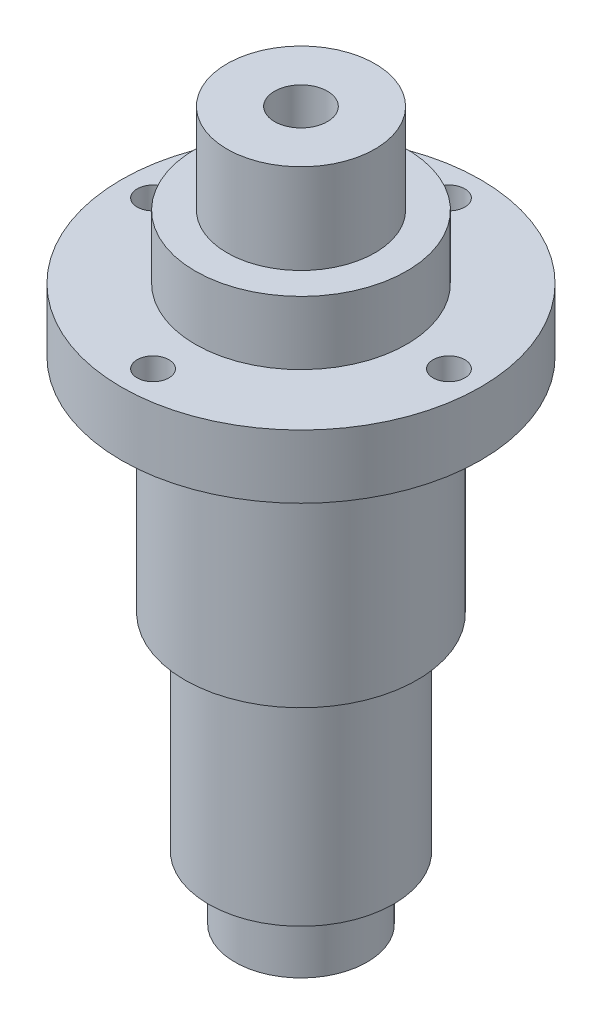
ISO-10303-21;
HEADER;
FILE_DESCRIPTION(('STEP AP214'),'2;1');
FILE_NAME('part.step','',(''),(''),'','','');
FILE_SCHEMA(('AUTOMOTIVE_DESIGN { 1 0 10303 214 1 1 1 1 }'));
ENDSEC;
DATA;
#1=APPLICATION_CONTEXT('core data for automotive mechanical design processes');
#2=APPLICATION_PROTOCOL_DEFINITION('international standard','automotive_design',2000,#1);
#3=PRODUCT_CONTEXT('',#1,'mechanical');
#4=PRODUCT('Part','Part','',(#3));
#5=PRODUCT_RELATED_PRODUCT_CATEGORY('part','',(#4));
#6=PRODUCT_DEFINITION_FORMATION('','',#4);
#7=PRODUCT_DEFINITION_CONTEXT('part definition',#1,'design');
#8=PRODUCT_DEFINITION('design','',#6,#7);
#9=PRODUCT_DEFINITION_SHAPE('','',#8);
#10=(LENGTH_UNIT() NAMED_UNIT(*) SI_UNIT(.MILLI.,.METRE.));
#11=(NAMED_UNIT(*) PLANE_ANGLE_UNIT() SI_UNIT($,.RADIAN.));
#12=(NAMED_UNIT(*) SI_UNIT($,.STERADIAN.) SOLID_ANGLE_UNIT());
#13=UNCERTAINTY_MEASURE_WITH_UNIT(LENGTH_MEASURE(1.E-05),#10,'distance_accuracy_value','');
#14=(GEOMETRIC_REPRESENTATION_CONTEXT(3) GLOBAL_UNCERTAINTY_ASSIGNED_CONTEXT((#13)) GLOBAL_UNIT_ASSIGNED_CONTEXT((#10,
#11,#12)) REPRESENTATION_CONTEXT('',''));
#15=CARTESIAN_POINT('',(0.,0.,0.));
#16=DIRECTION('',(0.,0.,1.));
#17=DIRECTION('',(1.,0.,0.));
#18=AXIS2_PLACEMENT_3D('',#15,#16,#17);
#19=CARTESIAN_POINT('',(0.,12.,0.));
#20=DIRECTION('',(0.,-1.,0.));
#21=DIRECTION('',(0.,0.,-1.));
#22=AXIS2_PLACEMENT_3D('',#19,#20,#21);
#23=CYLINDRICAL_SURFACE('',#22,20.);
#24=CARTESIAN_POINT('',(0.,12.,0.));
#25=DIRECTION('',(0.,1.,0.));
#26=DIRECTION('',(0.,0.,1.));
#27=AXIS2_PLACEMENT_3D('',#24,#25,#26);
#28=CIRCLE('',#27,20.);
#29=CARTESIAN_POINT('',(0.,12.,20.));
#30=VERTEX_POINT('',#29);
#31=EDGE_CURVE('E123',#30,#30,#28,.T.);
#32=ORIENTED_EDGE('',*,*,#31,.F.);
#33=EDGE_LOOP('',(#32));
#34=FACE_BOUND('',#33,.T.);
#35=CARTESIAN_POINT('',(0.,0.,0.));
#36=DIRECTION('',(0.,1.,0.));
#37=DIRECTION('',(0.,0.,1.));
#38=AXIS2_PLACEMENT_3D('',#35,#36,#37);
#39=CIRCLE('',#38,20.);
#40=CARTESIAN_POINT('',(0.,0.,20.));
#41=VERTEX_POINT('',#40);
#42=EDGE_CURVE('E54',#41,#41,#39,.T.);
#43=ORIENTED_EDGE('',*,*,#42,.T.);
#44=EDGE_LOOP('',(#43));
#45=FACE_BOUND('',#44,.T.);
#46=ADVANCED_FACE('F51',(#34,#45),#23,.T.);
#47=CARTESIAN_POINT('',(0.,12.,0.));
#48=DIRECTION('',(0.,1.,0.));
#49=DIRECTION('',(0.,0.,1.));
#50=AXIS2_PLACEMENT_3D('',#47,#48,#49);
#51=PLANE('',#50);
#52=CARTESIAN_POINT('',(0.,12.,0.));
#53=DIRECTION('',(0.,1.,0.));
#54=DIRECTION('',(0.,0.,1.));
#55=AXIS2_PLACEMENT_3D('',#52,#53,#54);
#56=CIRCLE('',#55,14.);
#57=CARTESIAN_POINT('',(0.,12.,14.));
#58=VERTEX_POINT('',#57);
#59=EDGE_CURVE('E12',#58,#58,#56,.T.);
#60=ORIENTED_EDGE('',*,*,#59,.F.);
#61=EDGE_LOOP('',(#60));
#62=FACE_BOUND('',#61,.T.);
#63=ORIENTED_EDGE('',*,*,#31,.T.);
#64=EDGE_LOOP('',(#63));
#65=FACE_BOUND('',#64,.T.);
#66=ADVANCED_FACE('F150',(#62,#65),#51,.T.);
#67=CARTESIAN_POINT('',(0.,-12.,0.));
#68=DIRECTION('',(0.,1.,0.));
#69=DIRECTION('',(0.,0.,1.));
#70=AXIS2_PLACEMENT_3D('',#67,#68,#69);
#71=CYLINDRICAL_SURFACE('',#70,34.);
#72=CARTESIAN_POINT('',(0.,-12.,0.));
#73=DIRECTION('',(0.,-1.,0.));
#74=DIRECTION('',(0.,0.,-1.));
#75=AXIS2_PLACEMENT_3D('',#72,#73,#74);
#76=CIRCLE('',#75,34.);
#77=CARTESIAN_POINT('',(0.,-12.,-34.));
#78=VERTEX_POINT('',#77);
#79=EDGE_CURVE('E124',#78,#78,#76,.T.);
#80=ORIENTED_EDGE('',*,*,#79,.F.);
#81=EDGE_LOOP('',(#80));
#82=FACE_BOUND('',#81,.T.);
#83=CARTESIAN_POINT('',(0.,0.,0.));
#84=DIRECTION('',(0.,-1.,0.));
#85=DIRECTION('',(0.,0.,-1.));
#86=AXIS2_PLACEMENT_3D('',#83,#84,#85);
#87=CIRCLE('',#86,34.);
#88=CARTESIAN_POINT('',(0.,0.,-34.));
#89=VERTEX_POINT('',#88);
#90=EDGE_CURVE('E119',#89,#89,#87,.T.);
#91=ORIENTED_EDGE('',*,*,#90,.T.);
#92=EDGE_LOOP('',(#91));
#93=FACE_BOUND('',#92,.T.);
#94=ADVANCED_FACE('F148',(#82,#93),#71,.T.);
#95=CARTESIAN_POINT('',(0.,-12.,0.));
#96=DIRECTION('',(0.,-1.,0.));
#97=DIRECTION('',(0.,0.,-1.));
#98=AXIS2_PLACEMENT_3D('',#95,#96,#97);
#99=PLANE('',#98);
#100=CARTESIAN_POINT('',(28.,-12.,0.));
#101=DIRECTION('',(0.,-1.,0.));
#102=DIRECTION('',(-1.,0.,0.));
#103=AXIS2_PLACEMENT_3D('',#100,#101,#102);
#104=CIRCLE('',#103,3.);
#105=CARTESIAN_POINT('',(25.,-12.,0.));
#106=VERTEX_POINT('',#105);
#107=EDGE_CURVE('E75',#106,#106,#104,.T.);
#108=ORIENTED_EDGE('',*,*,#107,.F.);
#109=EDGE_LOOP('',(#108));
#110=FACE_BOUND('',#109,.T.);
#111=CARTESIAN_POINT('',(0.,-12.,-28.));
#112=DIRECTION('',(0.,-1.,0.));
#113=DIRECTION('',(0.,0.,1.));
#114=AXIS2_PLACEMENT_3D('',#111,#112,#113);
#115=CIRCLE('',#114,3.);
#116=CARTESIAN_POINT('',(0.,-12.,-25.));
#117=VERTEX_POINT('',#116);
#118=EDGE_CURVE('E76',#117,#117,#115,.T.);
#119=ORIENTED_EDGE('',*,*,#118,.F.);
#120=EDGE_LOOP('',(#119));
#121=FACE_BOUND('',#120,.T.);
#122=CARTESIAN_POINT('',(-28.,-12.,2.93284432462823E-13));
#123=DIRECTION('',(0.,-1.,0.));
#124=DIRECTION('',(1.,0.,0.));
#125=AXIS2_PLACEMENT_3D('',#122,#123,#124);
#126=CIRCLE('',#125,3.);
#127=CARTESIAN_POINT('',(-25.,-12.,2.61861100413235E-13));
#128=VERTEX_POINT('',#127);
#129=EDGE_CURVE('E85',#128,#128,#126,.T.);
#130=ORIENTED_EDGE('',*,*,#129,.F.);
#131=EDGE_LOOP('',(#130));
#132=FACE_BOUND('',#131,.T.);
#133=CARTESIAN_POINT('',(0.,-12.,28.));
#134=DIRECTION('',(0.,-1.,0.));
#135=DIRECTION('',(0.,0.,-1.));
#136=AXIS2_PLACEMENT_3D('',#133,#134,#135);
#137=CIRCLE('',#136,3.);
#138=CARTESIAN_POINT('',(0.,-12.,25.));
#139=VERTEX_POINT('',#138);
#140=EDGE_CURVE('E80',#139,#139,#137,.T.);
#141=ORIENTED_EDGE('',*,*,#140,.F.);
#142=EDGE_LOOP('',(#141));
#143=FACE_BOUND('',#142,.T.);
#144=CARTESIAN_POINT('',(0.,-12.,0.));
#145=DIRECTION('',(0.,-1.,0.));
#146=DIRECTION('',(0.,0.,-1.));
#147=AXIS2_PLACEMENT_3D('',#144,#145,#146);
#148=CIRCLE('',#147,22.);
#149=CARTESIAN_POINT('',(0.,-12.,22.));
#150=VERTEX_POINT('',#149);
#151=EDGE_CURVE('E115',#150,#150,#148,.T.);
#152=ORIENTED_EDGE('',*,*,#151,.F.);
#153=EDGE_LOOP('',(#152));
#154=FACE_BOUND('',#153,.T.);
#155=ORIENTED_EDGE('',*,*,#79,.T.);
#156=EDGE_LOOP('',(#155));
#157=FACE_BOUND('',#156,.T.);
#158=ADVANCED_FACE('F143',(#110,#121,#132,#143,#154,#157),#99,.T.);
#159=CARTESIAN_POINT('',(0.,0.,0.));
#160=DIRECTION('',(0.,-1.,0.));
#161=DIRECTION('',(0.,0.,-1.));
#162=AXIS2_PLACEMENT_3D('',#159,#160,#161);
#163=PLANE('',#162);
#164=CARTESIAN_POINT('',(28.,0.,0.));
#165=DIRECTION('',(0.,-1.,0.));
#166=DIRECTION('',(-1.,0.,0.));
#167=AXIS2_PLACEMENT_3D('',#164,#165,#166);
#168=CIRCLE('',#167,3.);
#169=CARTESIAN_POINT('',(25.,0.,0.));
#170=VERTEX_POINT('',#169);
#171=EDGE_CURVE('E71',#170,#170,#168,.T.);
#172=ORIENTED_EDGE('',*,*,#171,.T.);
#173=EDGE_LOOP('',(#172));
#174=FACE_BOUND('',#173,.T.);
#175=CARTESIAN_POINT('',(0.,0.,-28.));
#176=DIRECTION('',(0.,-1.,0.));
#177=DIRECTION('',(0.,0.,1.));
#178=AXIS2_PLACEMENT_3D('',#175,#176,#177);
#179=CIRCLE('',#178,3.);
#180=CARTESIAN_POINT('',(0.,0.,-25.));
#181=VERTEX_POINT('',#180);
#182=EDGE_CURVE('E81',#181,#181,#179,.T.);
#183=ORIENTED_EDGE('',*,*,#182,.T.);
#184=EDGE_LOOP('',(#183));
#185=FACE_BOUND('',#184,.T.);
#186=CARTESIAN_POINT('',(-28.,0.,2.93284432462823E-13));
#187=DIRECTION('',(0.,-1.,0.));
#188=DIRECTION('',(1.,0.,0.));
#189=AXIS2_PLACEMENT_3D('',#186,#187,#188);
#190=CIRCLE('',#189,3.);
#191=CARTESIAN_POINT('',(-25.,0.,2.61861100413235E-13));
#192=VERTEX_POINT('',#191);
#193=EDGE_CURVE('E89',#192,#192,#190,.T.);
#194=ORIENTED_EDGE('',*,*,#193,.T.);
#195=EDGE_LOOP('',(#194));
#196=FACE_BOUND('',#195,.T.);
#197=CARTESIAN_POINT('',(0.,0.,28.));
#198=DIRECTION('',(0.,-1.,0.));
#199=DIRECTION('',(0.,0.,-1.));
#200=AXIS2_PLACEMENT_3D('',#197,#198,#199);
#201=CIRCLE('',#200,3.);
#202=CARTESIAN_POINT('',(0.,0.,25.));
#203=VERTEX_POINT('',#202);
#204=EDGE_CURVE('E96',#203,#203,#201,.T.);
#205=ORIENTED_EDGE('',*,*,#204,.T.);
#206=EDGE_LOOP('',(#205));
#207=FACE_BOUND('',#206,.T.);
#208=ORIENTED_EDGE('',*,*,#42,.F.);
#209=EDGE_LOOP('',(#208));
#210=FACE_BOUND('',#209,.T.);
#211=ORIENTED_EDGE('',*,*,#90,.F.);
#212=EDGE_LOOP('',(#211));
#213=FACE_BOUND('',#212,.T.);
#214=ADVANCED_FACE('F139',(#174,#185,#196,#207,#210,#213),#163,.F.);
#215=CARTESIAN_POINT('',(0.,-54.,0.));
#216=DIRECTION('',(0.,1.,0.));
#217=DIRECTION('',(0.,0.,1.));
#218=AXIS2_PLACEMENT_3D('',#215,#216,#217);
#219=CYLINDRICAL_SURFACE('',#218,22.);
#220=CARTESIAN_POINT('',(0.,-54.,0.));
#221=DIRECTION('',(0.,-1.,0.));
#222=DIRECTION('',(0.,0.,-1.));
#223=AXIS2_PLACEMENT_3D('',#220,#221,#222);
#224=CIRCLE('',#223,22.);
#225=CARTESIAN_POINT('',(0.,-54.,22.));
#226=VERTEX_POINT('',#225);
#227=EDGE_CURVE('E111',#226,#226,#224,.T.);
#228=CARTESIAN_POINT('',(0.,-54.,22.));
#229=CARTESIAN_POINT('',(0.,-53.5625,22.));
#230=CARTESIAN_POINT('',(0.,-53.125,22.));
#231=CARTESIAN_POINT('',(0.,-52.25,22.));
#232=CARTESIAN_POINT('',(0.,-51.8125,22.));
#233=CARTESIAN_POINT('',(0.,-50.9375,22.));
#234=CARTESIAN_POINT('',(0.,-50.5,22.));
#235=CARTESIAN_POINT('',(0.,-49.625,22.));
#236=CARTESIAN_POINT('',(0.,-49.1875,22.));
#237=CARTESIAN_POINT('',(0.,-48.3125,22.));
#238=CARTESIAN_POINT('',(0.,-47.875,22.));
#239=CARTESIAN_POINT('',(0.,-47.,22.));
#240=CARTESIAN_POINT('',(0.,-46.5625,22.));
#241=CARTESIAN_POINT('',(0.,-45.6875,22.));
#242=CARTESIAN_POINT('',(0.,-45.25,22.));
#243=CARTESIAN_POINT('',(0.,-44.375,22.));
#244=CARTESIAN_POINT('',(0.,-43.9375,22.));
#245=CARTESIAN_POINT('',(0.,-43.0625,22.));
#246=CARTESIAN_POINT('',(0.,-42.625,22.));
#247=CARTESIAN_POINT('',(0.,-41.75,22.));
#248=CARTESIAN_POINT('',(0.,-41.3125,22.));
#249=CARTESIAN_POINT('',(0.,-40.4375,22.));
#250=CARTESIAN_POINT('',(0.,-40.,22.));
#251=CARTESIAN_POINT('',(0.,-39.125,22.));
#252=CARTESIAN_POINT('',(0.,-38.6875,22.));
#253=CARTESIAN_POINT('',(0.,-37.8125,22.));
#254=CARTESIAN_POINT('',(0.,-37.375,22.));
#255=CARTESIAN_POINT('',(0.,-36.5,22.));
#256=CARTESIAN_POINT('',(0.,-36.0625,22.));
#257=CARTESIAN_POINT('',(0.,-35.1875,22.));
#258=CARTESIAN_POINT('',(0.,-34.75,22.));
#259=CARTESIAN_POINT('',(0.,-33.875,22.));
#260=CARTESIAN_POINT('',(0.,-33.4375,22.));
#261=CARTESIAN_POINT('',(0.,-32.5625,22.));
#262=CARTESIAN_POINT('',(0.,-32.125,22.));
#263=CARTESIAN_POINT('',(0.,-31.25,22.));
#264=CARTESIAN_POINT('',(0.,-30.8125,22.));
#265=CARTESIAN_POINT('',(0.,-29.9375,22.));
#266=CARTESIAN_POINT('',(0.,-29.5,22.));
#267=CARTESIAN_POINT('',(0.,-28.625,22.));
#268=CARTESIAN_POINT('',(0.,-28.1875,22.));
#269=CARTESIAN_POINT('',(0.,-27.3125,22.));
#270=CARTESIAN_POINT('',(0.,-26.875,22.));
#271=CARTESIAN_POINT('',(0.,-26.,22.));
#272=CARTESIAN_POINT('',(0.,-25.5625,22.));
#273=CARTESIAN_POINT('',(0.,-24.6875,22.));
#274=CARTESIAN_POINT('',(0.,-24.25,22.));
#275=CARTESIAN_POINT('',(0.,-23.375,22.));
#276=CARTESIAN_POINT('',(0.,-22.9375,22.));
#277=CARTESIAN_POINT('',(0.,-22.0625,22.));
#278=CARTESIAN_POINT('',(0.,-21.625,22.));
#279=CARTESIAN_POINT('',(0.,-20.75,22.));
#280=CARTESIAN_POINT('',(0.,-20.3125,22.));
#281=CARTESIAN_POINT('',(0.,-19.4375,22.));
#282=CARTESIAN_POINT('',(0.,-19.,22.));
#283=CARTESIAN_POINT('',(0.,-18.125,22.));
#284=CARTESIAN_POINT('',(0.,-17.6875,22.));
#285=CARTESIAN_POINT('',(0.,-16.8125,22.));
#286=CARTESIAN_POINT('',(0.,-16.375,22.));
#287=CARTESIAN_POINT('',(0.,-15.5,22.));
#288=CARTESIAN_POINT('',(0.,-15.0625,22.));
#289=CARTESIAN_POINT('',(0.,-14.1875,22.));
#290=CARTESIAN_POINT('',(0.,-13.75,22.));
#291=CARTESIAN_POINT('',(0.,-12.875,22.));
#292=CARTESIAN_POINT('',(0.,-12.4375,22.));
#293=CARTESIAN_POINT('',(0.,-12.,22.));
#294=B_SPLINE_CURVE_WITH_KNOTS('',3,(#228,#229,#230,#231,#232,#233,#234,#235,#236,#237,#238,
#239,#240,#241,#242,#243,#244,#245,#246,#247,#248,#249,#250,#251,#252,#253,#254,#255,#256,#257,
#258,#259,#260,#261,#262,#263,#264,#265,#266,#267,#268,#269,#270,#271,#272,#273,#274,#275,#276,
#277,#278,#279,#280,#281,#282,#283,#284,#285,#286,#287,#288,#289,#290,#291,#292,#293),
.UNSPECIFIED.,.F.,.F.,(4,2,2,2,2,2,2,2,2,2,2,2,2,2,2,2,2,2,2,2,2,2,2,2,2,2,2,2,2,2,2,2,4),(0.,
1.3125,2.625,3.9375,5.25,6.56250000000001,7.87500000000001,9.1875,10.5,11.8125,13.125,14.4375,
15.75,17.0625,18.375,19.6875,21.,22.3125,23.625,24.9375,26.25,27.5625,28.875,30.1875,31.5,
32.8125,34.125,35.4375,36.75,38.0625,39.375,40.6875,42.),.UNSPECIFIED.);
#295=EDGE_CURVE('BSEAM142',#226,#150,#294,.T.);
#296=ORIENTED_EDGE('',*,*,#227,.F.);
#297=ORIENTED_EDGE('',*,*,#151,.T.);
#298=ORIENTED_EDGE('',*,*,#295,.T.);
#299=ORIENTED_EDGE('',*,*,#295,.F.);
#300=EDGE_LOOP('',(#296,#298,#297,#299));
#301=FACE_BOUND('',#300,.T.);
#302=ADVANCED_FACE('F142',(#301),#219,.T.);
#303=CARTESIAN_POINT('',(0.,-54.,0.));
#304=DIRECTION('',(0.,-1.,0.));
#305=DIRECTION('',(0.,0.,-1.));
#306=AXIS2_PLACEMENT_3D('',#303,#304,#305);
#307=PLANE('',#306);
#308=CARTESIAN_POINT('',(0.,-54.,0.));
#309=DIRECTION('',(0.,-1.,0.));
#310=DIRECTION('',(0.,0.,-1.));
#311=AXIS2_PLACEMENT_3D('',#308,#309,#310);
#312=CIRCLE('',#311,17.5);
#313=CARTESIAN_POINT('',(0.,-54.,-17.5));
#314=VERTEX_POINT('',#313);
#315=EDGE_CURVE('E65',#314,#314,#312,.T.);
#316=ORIENTED_EDGE('',*,*,#315,.F.);
#317=EDGE_LOOP('',(#316));
#318=FACE_BOUND('',#317,.T.);
#319=ORIENTED_EDGE('',*,*,#227,.T.);
#320=EDGE_LOOP('',(#319));
#321=FACE_BOUND('',#320,.T.);
#322=ADVANCED_FACE('F251',(#318,#321),#307,.T.);
#323=CARTESIAN_POINT('',(0.,-93.,0.));
#324=DIRECTION('',(0.,1.,0.));
#325=DIRECTION('',(0.,0.,1.));
#326=AXIS2_PLACEMENT_3D('',#323,#324,#325);
#327=CYLINDRICAL_SURFACE('',#326,17.5);
#328=CARTESIAN_POINT('',(0.,-93.,0.));
#329=DIRECTION('',(0.,-1.,0.));
#330=DIRECTION('',(0.,0.,-1.));
#331=AXIS2_PLACEMENT_3D('',#328,#329,#330);
#332=CIRCLE('',#331,17.5);
#333=CARTESIAN_POINT('',(0.,-93.,-17.5));
#334=VERTEX_POINT('',#333);
#335=EDGE_CURVE('E106',#334,#334,#332,.T.);
#336=ORIENTED_EDGE('',*,*,#335,.F.);
#337=EDGE_LOOP('',(#336));
#338=FACE_BOUND('',#337,.T.);
#339=ORIENTED_EDGE('',*,*,#315,.T.);
#340=EDGE_LOOP('',(#339));
#341=FACE_BOUND('',#340,.T.);
#342=ADVANCED_FACE('F247',(#338,#341),#327,.T.);
#343=CARTESIAN_POINT('',(0.,-93.,0.));
#344=DIRECTION('',(0.,-1.,0.));
#345=DIRECTION('',(0.,0.,-1.));
#346=AXIS2_PLACEMENT_3D('',#343,#344,#345);
#347=PLANE('',#346);
#348=CARTESIAN_POINT('',(0.,-93.,0.));
#349=DIRECTION('',(0.,-1.,0.));
#350=DIRECTION('',(0.,0.,-1.));
#351=AXIS2_PLACEMENT_3D('',#348,#349,#350);
#352=CIRCLE('',#351,12.5);
#353=CARTESIAN_POINT('',(0.,-93.,-12.5));
#354=VERTEX_POINT('',#353);
#355=EDGE_CURVE('E59',#354,#354,#352,.T.);
#356=ORIENTED_EDGE('',*,*,#355,.F.);
#357=EDGE_LOOP('',(#356));
#358=FACE_BOUND('',#357,.T.);
#359=ORIENTED_EDGE('',*,*,#335,.T.);
#360=EDGE_LOOP('',(#359));
#361=FACE_BOUND('',#360,.T.);
#362=ADVANCED_FACE('F243',(#358,#361),#347,.T.);
#363=CARTESIAN_POINT('',(0.,-105.,0.));
#364=DIRECTION('',(0.,1.,0.));
#365=DIRECTION('',(0.,0.,1.));
#366=AXIS2_PLACEMENT_3D('',#363,#364,#365);
#367=CYLINDRICAL_SURFACE('',#366,12.5);
#368=CARTESIAN_POINT('',(0.,-105.,0.));
#369=DIRECTION('',(0.,-1.,0.));
#370=DIRECTION('',(0.,0.,-1.));
#371=AXIS2_PLACEMENT_3D('',#368,#369,#370);
#372=CIRCLE('',#371,12.5);
#373=CARTESIAN_POINT('',(0.,-105.,-12.5));
#374=VERTEX_POINT('',#373);
#375=EDGE_CURVE('E100',#374,#374,#372,.T.);
#376=ORIENTED_EDGE('',*,*,#375,.F.);
#377=EDGE_LOOP('',(#376));
#378=FACE_BOUND('',#377,.T.);
#379=ORIENTED_EDGE('',*,*,#355,.T.);
#380=EDGE_LOOP('',(#379));
#381=FACE_BOUND('',#380,.T.);
#382=ADVANCED_FACE('F239',(#378,#381),#367,.T.);
#383=CARTESIAN_POINT('',(0.,-105.,0.));
#384=DIRECTION('',(0.,-1.,0.));
#385=DIRECTION('',(0.,0.,-1.));
#386=AXIS2_PLACEMENT_3D('',#383,#384,#385);
#387=PLANE('',#386);
#388=ORIENTED_EDGE('',*,*,#375,.T.);
#389=EDGE_LOOP('',(#388));
#390=FACE_BOUND('',#389,.T.);
#391=ADVANCED_FACE('F235',(#390),#387,.T.);
#392=CARTESIAN_POINT('',(0.,0.,28.));
#393=DIRECTION('',(0.,-1.,0.));
#394=DIRECTION('',(0.,0.,-1.));
#395=AXIS2_PLACEMENT_3D('',#392,#393,#394);
#396=CYLINDRICAL_SURFACE('',#395,3.);
#397=ORIENTED_EDGE('',*,*,#204,.F.);
#398=EDGE_LOOP('',(#397));
#399=FACE_BOUND('',#398,.T.);
#400=ORIENTED_EDGE('',*,*,#140,.T.);
#401=EDGE_LOOP('',(#400));
#402=FACE_BOUND('',#401,.T.);
#403=ADVANCED_FACE('F231',(#399,#402),#396,.F.);
#404=CARTESIAN_POINT('',(-28.,0.,2.93284432462823E-13));
#405=DIRECTION('',(0.,-1.,0.));
#406=DIRECTION('',(1.,0.,0.));
#407=AXIS2_PLACEMENT_3D('',#404,#405,#406);
#408=CYLINDRICAL_SURFACE('',#407,3.);
#409=ORIENTED_EDGE('',*,*,#193,.F.);
#410=EDGE_LOOP('',(#409));
#411=FACE_BOUND('',#410,.T.);
#412=ORIENTED_EDGE('',*,*,#129,.T.);
#413=EDGE_LOOP('',(#412));
#414=FACE_BOUND('',#413,.T.);
#415=ADVANCED_FACE('F227',(#411,#414),#408,.F.);
#416=CARTESIAN_POINT('',(0.,0.,-28.));
#417=DIRECTION('',(0.,-1.,0.));
#418=DIRECTION('',(0.,0.,1.));
#419=AXIS2_PLACEMENT_3D('',#416,#417,#418);
#420=CYLINDRICAL_SURFACE('',#419,3.);
#421=ORIENTED_EDGE('',*,*,#182,.F.);
#422=EDGE_LOOP('',(#421));
#423=FACE_BOUND('',#422,.T.);
#424=ORIENTED_EDGE('',*,*,#118,.T.);
#425=EDGE_LOOP('',(#424));
#426=FACE_BOUND('',#425,.T.);
#427=ADVANCED_FACE('F223',(#423,#426),#420,.F.);
#428=CARTESIAN_POINT('',(28.,0.,0.));
#429=DIRECTION('',(0.,-1.,0.));
#430=DIRECTION('',(-1.,0.,0.));
#431=AXIS2_PLACEMENT_3D('',#428,#429,#430);
#432=CYLINDRICAL_SURFACE('',#431,3.);
#433=ORIENTED_EDGE('',*,*,#171,.F.);
#434=EDGE_LOOP('',(#433));
#435=FACE_BOUND('',#434,.T.);
#436=ORIENTED_EDGE('',*,*,#107,.T.);
#437=EDGE_LOOP('',(#436));
#438=FACE_BOUND('',#437,.T.);
#439=ADVANCED_FACE('F176',(#435,#438),#432,.F.);
#440=CARTESIAN_POINT('',(0.,29.,0.));
#441=DIRECTION('',(0.,-1.,0.));
#442=DIRECTION('',(0.,0.,-1.));
#443=AXIS2_PLACEMENT_3D('',#440,#441,#442);
#444=CYLINDRICAL_SURFACE('',#443,14.);
#445=CARTESIAN_POINT('',(0.,29.,0.));
#446=DIRECTION('',(0.,1.,0.));
#447=DIRECTION('',(0.,0.,1.));
#448=AXIS2_PLACEMENT_3D('',#445,#446,#447);
#449=CIRCLE('',#448,14.);
#450=CARTESIAN_POINT('',(0.,29.,14.));
#451=VERTEX_POINT('',#450);
#452=EDGE_CURVE('E69',#451,#451,#449,.T.);
#453=ORIENTED_EDGE('',*,*,#452,.F.);
#454=EDGE_LOOP('',(#453));
#455=FACE_BOUND('',#454,.T.);
#456=ORIENTED_EDGE('',*,*,#59,.T.);
#457=EDGE_LOOP('',(#456));
#458=FACE_BOUND('',#457,.T.);
#459=ADVANCED_FACE('F181',(#455,#458),#444,.T.);
#460=CARTESIAN_POINT('',(0.,29.,0.));
#461=DIRECTION('',(0.,1.,0.));
#462=DIRECTION('',(0.,0.,1.));
#463=AXIS2_PLACEMENT_3D('',#460,#461,#462);
#464=PLANE('',#463);
#465=CARTESIAN_POINT('',(0.,29.,0.));
#466=DIRECTION('',(0.,1.,0.));
#467=DIRECTION('',(0.,0.,1.));
#468=AXIS2_PLACEMENT_3D('',#465,#466,#467);
#469=CIRCLE('',#468,5.);
#470=CARTESIAN_POINT('',(0.,29.,5.));
#471=VERTEX_POINT('',#470);
#472=EDGE_CURVE('E363',#471,#471,#469,.T.);
#473=ORIENTED_EDGE('',*,*,#472,.F.);
#474=EDGE_LOOP('',(#473));
#475=FACE_BOUND('',#474,.T.);
#476=ORIENTED_EDGE('',*,*,#452,.T.);
#477=EDGE_LOOP('',(#476));
#478=FACE_BOUND('',#477,.T.);
#479=ADVANCED_FACE('F186',(#475,#478),#464,.T.);
#480=CARTESIAN_POINT('',(0.,14.,0.));
#481=DIRECTION('',(0.,1.,0.));
#482=DIRECTION('',(0.,0.,1.));
#483=AXIS2_PLACEMENT_3D('',#480,#481,#482);
#484=CYLINDRICAL_SURFACE('',#483,5.);
#485=CARTESIAN_POINT('',(0.,14.,0.));
#486=DIRECTION('',(0.,1.,0.));
#487=DIRECTION('',(0.,0.,1.));
#488=AXIS2_PLACEMENT_3D('',#485,#486,#487);
#489=CIRCLE('',#488,5.);
#490=CARTESIAN_POINT('',(0.,14.,5.));
#491=VERTEX_POINT('',#490);
#492=EDGE_CURVE('E361',#491,#491,#489,.T.);
#493=ORIENTED_EDGE('',*,*,#492,.F.);
#494=EDGE_LOOP('',(#493));
#495=FACE_BOUND('',#494,.T.);
#496=ORIENTED_EDGE('',*,*,#472,.T.);
#497=EDGE_LOOP('',(#496));
#498=FACE_BOUND('',#497,.T.);
#499=ADVANCED_FACE('F196',(#495,#498),#484,.F.);
#500=CARTESIAN_POINT('',(0.,14.,0.));
#501=DIRECTION('',(0.,1.,0.));
#502=DIRECTION('',(0.,0.,1.));
#503=AXIS2_PLACEMENT_3D('',#500,#501,#502);
#504=PLANE('',#503);
#505=ORIENTED_EDGE('',*,*,#492,.T.);
#506=EDGE_LOOP('',(#505));
#507=FACE_BOUND('',#506,.T.);
#508=ADVANCED_FACE('F206',(#507),#504,.T.);
#509=CLOSED_SHELL('',(#46,#66,#94,#158,#214,#302,#322,#342,#362,#382,#391,#403,#415,#427,#439,
#459,#479,#499,#508));
#510=MANIFOLD_SOLID_BREP('B2',#509);
#511=ADVANCED_BREP_SHAPE_REPRESENTATION('',(#18,#510),#14);
#512=SHAPE_DEFINITION_REPRESENTATION(#9,#511);
ENDSEC;
END-ISO-10303-21;
